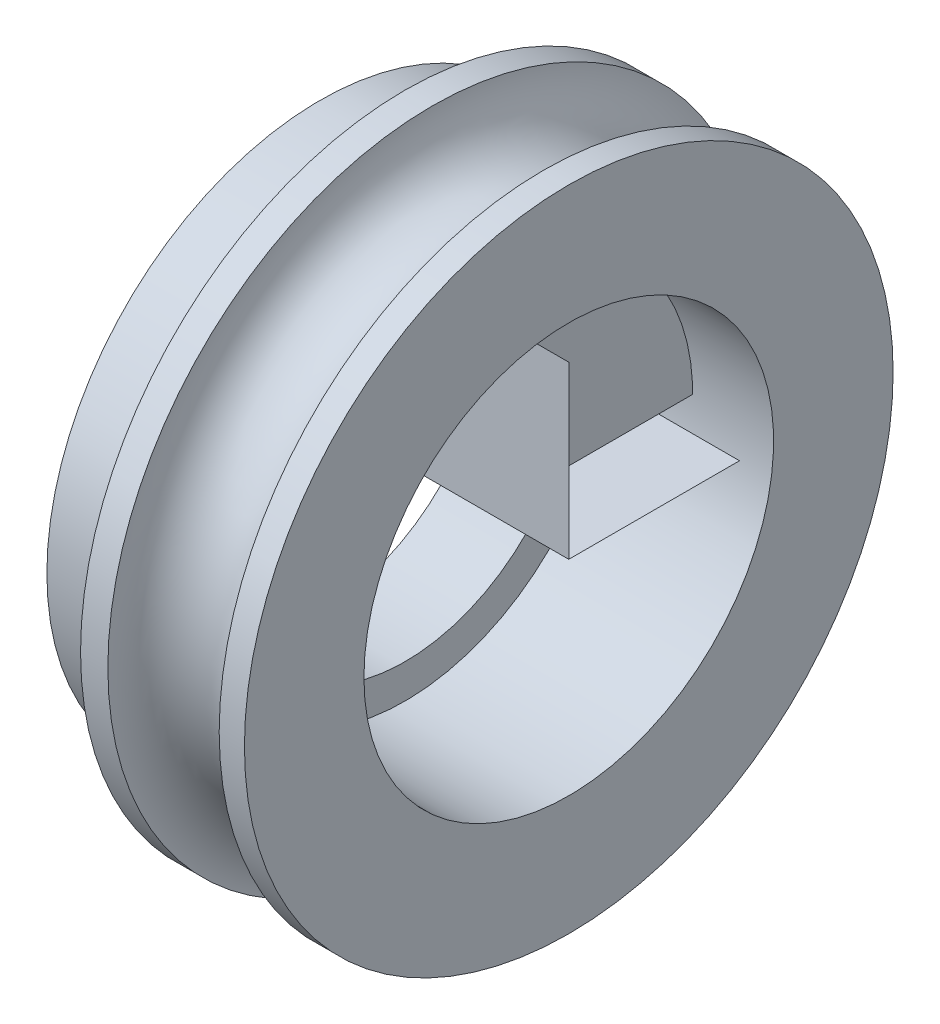
ISO-10303-21;
HEADER;
FILE_DESCRIPTION(('STEP AP214'),'2;1');
FILE_NAME('part.step','',(''),(''),'','','');
FILE_SCHEMA(('AUTOMOTIVE_DESIGN { 1 0 10303 214 1 1 1 1 }'));
ENDSEC;
DATA;
#1=APPLICATION_CONTEXT('core data for automotive mechanical design processes');
#2=APPLICATION_PROTOCOL_DEFINITION('international standard','automotive_design',2000,#1);
#3=PRODUCT_CONTEXT('',#1,'mechanical');
#4=PRODUCT('Part','Part','',(#3));
#5=PRODUCT_RELATED_PRODUCT_CATEGORY('part','',(#4));
#6=PRODUCT_DEFINITION_FORMATION('','',#4);
#7=PRODUCT_DEFINITION_CONTEXT('part definition',#1,'design');
#8=PRODUCT_DEFINITION('design','',#6,#7);
#9=PRODUCT_DEFINITION_SHAPE('','',#8);
#10=(LENGTH_UNIT() NAMED_UNIT(*) SI_UNIT(.MILLI.,.METRE.));
#11=(NAMED_UNIT(*) PLANE_ANGLE_UNIT() SI_UNIT($,.RADIAN.));
#12=(NAMED_UNIT(*) SI_UNIT($,.STERADIAN.) SOLID_ANGLE_UNIT());
#13=UNCERTAINTY_MEASURE_WITH_UNIT(LENGTH_MEASURE(1.E-05),#10,'distance_accuracy_value','');
#14=(GEOMETRIC_REPRESENTATION_CONTEXT(3) GLOBAL_UNCERTAINTY_ASSIGNED_CONTEXT((#13)) GLOBAL_UNIT_ASSIGNED_CONTEXT((#10,
#11,#12)) REPRESENTATION_CONTEXT('',''));
#15=CARTESIAN_POINT('',(0.,0.,0.));
#16=DIRECTION('',(0.,0.,1.));
#17=DIRECTION('',(1.,0.,0.));
#18=AXIS2_PLACEMENT_3D('',#15,#16,#17);
#19=CARTESIAN_POINT('',(2.43012775386618,0.,0.));
#20=DIRECTION('',(1.,0.,0.));
#21=DIRECTION('',(0.,0.,-1.));
#22=AXIS2_PLACEMENT_3D('',#19,#20,#21);
#23=PLANE('',#22);
#24=DIRECTION('',(0.,0.,-1.));
#25=VECTOR('',#24,1.);
#26=CARTESIAN_POINT('',(2.43012775386618,5.,0.));
#27=LINE('',#26,#25);
#28=CARTESIAN_POINT('',(2.43012775386618,5.,0.));
#29=VERTEX_POINT('',#28);
#30=CARTESIAN_POINT('',(2.43012775386618,5.,-6.20938754824373));
#31=VERTEX_POINT('',#30);
#32=EDGE_CURVE('E65',#29,#31,#27,.T.);
#33=ORIENTED_EDGE('',*,*,#32,.F.);
#34=DIRECTION('',(0.,1.,0.));
#35=VECTOR('',#34,1.);
#36=CARTESIAN_POINT('',(2.43012775386618,0.,0.));
#37=LINE('',#36,#35);
#38=CARTESIAN_POINT('',(2.43012775386618,0.,0.));
#39=VERTEX_POINT('',#38);
#40=EDGE_CURVE('E47',#39,#29,#37,.T.);
#41=ORIENTED_EDGE('',*,*,#40,.F.);
#42=DIRECTION('',(0.,0.,-1.));
#43=VECTOR('',#42,1.);
#44=CARTESIAN_POINT('',(2.43012775386618,0.,0.));
#45=LINE('',#44,#43);
#46=CARTESIAN_POINT('',(2.43012775386618,0.,-6.20938754824373));
#47=VERTEX_POINT('',#46);
#48=EDGE_CURVE('E53',#39,#47,#45,.T.);
#49=ORIENTED_EDGE('',*,*,#48,.T.);
#50=DIRECTION('',(0.,1.,0.));
#51=VECTOR('',#50,1.);
#52=CARTESIAN_POINT('',(2.43012775386618,0.,-6.20938754824373));
#53=LINE('',#52,#51);
#54=EDGE_CURVE('E12',#47,#31,#53,.T.);
#55=ORIENTED_EDGE('',*,*,#54,.T.);
#56=EDGE_LOOP('',(#33,#41,#49,#55));
#57=FACE_BOUND('',#56,.T.);
#58=ADVANCED_FACE('F46',(#57),#23,.T.);
#59=OPEN_SHELL('',(#58));
#60=SHELL_BASED_SURFACE_MODEL('B2',(#59));
#61=CARTESIAN_POINT('',(4.79999999999545,0.,0.));
#62=DIRECTION('',(0.,0.,-1.));
#63=DIRECTION('',(-1.,0.,0.));
#64=AXIS2_PLACEMENT_3D('',#61,#62,#63);
#65=PLANE('',#64);
#66=DIRECTION('',(0.,-1.,0.));
#67=VECTOR('',#66,1.);
#68=CARTESIAN_POINT('',(-0.200000000004547,0.,0.));
#69=LINE('',#68,#67);
#70=CARTESIAN_POINT('',(-0.200000000004547,5.,0.));
#71=VERTEX_POINT('',#70);
#72=CARTESIAN_POINT('',(-0.200000000004547,0.,0.));
#73=VERTEX_POINT('',#72);
#74=EDGE_CURVE('E135',#71,#73,#69,.T.);
#75=ORIENTED_EDGE('',*,*,#74,.F.);
#76=DIRECTION('',(-1.,0.,0.));
#77=VECTOR('',#76,1.);
#78=CARTESIAN_POINT('',(4.79999999999545,5.,0.));
#79=LINE('',#78,#77);
#80=CARTESIAN_POINT('',(4.79999999999545,5.,0.));
#81=VERTEX_POINT('',#80);
#82=EDGE_CURVE('E104',#81,#71,#79,.T.);
#83=ORIENTED_EDGE('',*,*,#82,.F.);
#84=DIRECTION('',(0.,-1.,0.));
#85=VECTOR('',#84,1.);
#86=CARTESIAN_POINT('',(4.79999999999545,0.,0.));
#87=LINE('',#86,#85);
#88=CARTESIAN_POINT('',(4.79999999999545,0.,0.));
#89=VERTEX_POINT('',#88);
#90=EDGE_CURVE('E44',#81,#89,#87,.T.);
#91=ORIENTED_EDGE('',*,*,#90,.T.);
#92=DIRECTION('',(-1.,0.,0.));
#93=VECTOR('',#92,1.);
#94=CARTESIAN_POINT('',(4.79999999999545,0.,0.));
#95=LINE('',#94,#93);
#96=EDGE_CURVE('E98',#89,#73,#95,.T.);
#97=ORIENTED_EDGE('',*,*,#96,.T.);
#98=EDGE_LOOP('',(#75,#83,#91,#97));
#99=FACE_BOUND('',#98,.T.);
#100=ADVANCED_FACE('F96',(#99),#65,.T.);
#101=CARTESIAN_POINT('',(4.79999999999545,0.,0.));
#102=DIRECTION('',(0.,1.,0.));
#103=DIRECTION('',(0.,0.,1.));
#104=AXIS2_PLACEMENT_3D('',#101,#102,#103);
#105=PLANE('',#104);
#106=DIRECTION('',(0.,0.,-1.));
#107=VECTOR('',#106,1.);
#108=CARTESIAN_POINT('',(-0.200000000004547,0.,0.));
#109=LINE('',#108,#107);
#110=CARTESIAN_POINT('',(-0.200000000004547,0.,-5.));
#111=VERTEX_POINT('',#110);
#112=EDGE_CURVE('E129',#73,#111,#109,.T.);
#113=ORIENTED_EDGE('',*,*,#112,.F.);
#114=ORIENTED_EDGE('',*,*,#96,.F.);
#115=DIRECTION('',(0.,0.,-1.));
#116=VECTOR('',#115,1.);
#117=CARTESIAN_POINT('',(4.79999999999545,0.,0.));
#118=LINE('',#117,#116);
#119=CARTESIAN_POINT('',(4.79999999999545,0.,-5.));
#120=VERTEX_POINT('',#119);
#121=EDGE_CURVE('E128',#89,#120,#118,.T.);
#122=ORIENTED_EDGE('',*,*,#121,.T.);
#123=DIRECTION('',(-1.,0.,0.));
#124=VECTOR('',#123,1.);
#125=CARTESIAN_POINT('',(4.79999999999545,0.,-5.));
#126=LINE('',#125,#124);
#127=EDGE_CURVE('E110',#120,#111,#126,.T.);
#128=ORIENTED_EDGE('',*,*,#127,.T.);
#129=EDGE_LOOP('',(#113,#114,#122,#128));
#130=FACE_BOUND('',#129,.T.);
#131=ADVANCED_FACE('F127',(#130),#105,.T.);
#132=OPEN_SHELL('',(#100,#131));
#133=SHELL_BASED_SURFACE_MODEL('B6',(#132));
#134=CARTESIAN_POINT('',(-3.18596968241991,0.,0.));
#135=DIRECTION('',(-1.,0.,0.));
#136=DIRECTION('',(0.,0.,1.));
#137=AXIS2_PLACEMENT_3D('',#134,#135,#136);
#138=CYLINDRICAL_SURFACE('',#137,5.);
#139=CARTESIAN_POINT('',(0.,0.,0.));
#140=DIRECTION('',(-1.,0.,0.));
#141=DIRECTION('',(0.,0.,1.));
#142=AXIS2_PLACEMENT_3D('',#139,#140,#141);
#143=CIRCLE('',#142,5.);
#144=CARTESIAN_POINT('',(0.,0.,5.));
#145=VERTEX_POINT('',#144);
#146=EDGE_CURVE('E197',#145,#145,#143,.T.);
#147=ORIENTED_EDGE('',*,*,#146,.F.);
#148=EDGE_LOOP('',(#147));
#149=FACE_BOUND('',#148,.T.);
#150=CARTESIAN_POINT('',(-2.48596968241991,0.,0.));
#151=DIRECTION('',(-1.,0.,0.));
#152=DIRECTION('',(0.,0.,1.));
#153=AXIS2_PLACEMENT_3D('',#150,#151,#152);
#154=CIRCLE('',#153,5.);
#155=CARTESIAN_POINT('',(-2.48596968241991,0.,5.));
#156=VERTEX_POINT('',#155);
#157=EDGE_CURVE('E203',#156,#156,#154,.T.);
#158=ORIENTED_EDGE('',*,*,#157,.T.);
#159=EDGE_LOOP('',(#158));
#160=FACE_BOUND('',#159,.T.);
#161=ADVANCED_FACE('F171',(#149,#160),#138,.F.);
#162=CARTESIAN_POINT('',(-3.18596968241991,0.,0.));
#163=DIRECTION('',(-1.,0.,0.));
#164=DIRECTION('',(0.,0.,1.));
#165=AXIS2_PLACEMENT_3D('',#162,#163,#164);
#166=CYLINDRICAL_SURFACE('',#165,8.);
#167=CARTESIAN_POINT('',(0.,0.,0.));
#168=DIRECTION('',(-1.,0.,0.));
#169=DIRECTION('',(0.,0.,1.));
#170=AXIS2_PLACEMENT_3D('',#167,#168,#169);
#171=CIRCLE('',#170,8.);
#172=CARTESIAN_POINT('',(0.,0.,8.));
#173=VERTEX_POINT('',#172);
#174=EDGE_CURVE('E200',#173,#173,#171,.T.);
#175=ORIENTED_EDGE('',*,*,#174,.T.);
#176=EDGE_LOOP('',(#175));
#177=FACE_BOUND('',#176,.T.);
#178=CARTESIAN_POINT('',(-2.48596968241991,0.,0.));
#179=DIRECTION('',(-1.,0.,0.));
#180=DIRECTION('',(0.,0.,1.));
#181=AXIS2_PLACEMENT_3D('',#178,#179,#180);
#182=CIRCLE('',#181,8.);
#183=CARTESIAN_POINT('',(-2.48596968241991,0.,8.));
#184=VERTEX_POINT('',#183);
#185=EDGE_CURVE('E175',#184,#184,#182,.F.);
#186=ORIENTED_EDGE('',*,*,#185,.T.);
#187=EDGE_LOOP('',(#186));
#188=FACE_BOUND('',#187,.T.);
#189=ADVANCED_FACE('F210',(#177,#188),#166,.T.);
#190=CARTESIAN_POINT('',(0.,-8.,0.));
#191=DIRECTION('',(-1.,0.,0.));
#192=DIRECTION('',(0.,0.,1.));
#193=AXIS2_PLACEMENT_3D('',#190,#191,#192);
#194=PLANE('',#193);
#195=CARTESIAN_POINT('',(0.,0.,0.));
#196=DIRECTION('',(-1.,0.,0.));
#197=DIRECTION('',(0.,0.,1.));
#198=AXIS2_PLACEMENT_3D('',#195,#196,#197);
#199=CIRCLE('',#198,9.5);
#200=CARTESIAN_POINT('',(0.,0.,9.5));
#201=VERTEX_POINT('',#200);
#202=EDGE_CURVE('E95',#201,#201,#199,.T.);
#203=ORIENTED_EDGE('',*,*,#202,.T.);
#204=EDGE_LOOP('',(#203));
#205=FACE_BOUND('',#204,.T.);
#206=ORIENTED_EDGE('',*,*,#174,.F.);
#207=EDGE_LOOP('',(#206));
#208=FACE_BOUND('',#207,.T.);
#209=ADVANCED_FACE('F173',(#205,#208),#194,.T.);
#210=CARTESIAN_POINT('',(-3.18596968241991,0.,0.));
#211=DIRECTION('',(-1.,0.,0.));
#212=DIRECTION('',(0.,0.,1.));
#213=AXIS2_PLACEMENT_3D('',#210,#211,#212);
#214=CYLINDRICAL_SURFACE('',#213,9.5);
#215=CARTESIAN_POINT('',(0.799999999997726,0.,0.));
#216=DIRECTION('',(-1.,0.,0.));
#217=DIRECTION('',(0.,0.,1.));
#218=AXIS2_PLACEMENT_3D('',#215,#216,#217);
#219=CIRCLE('',#218,9.5);
#220=CARTESIAN_POINT('',(0.799999999997726,0.,9.5));
#221=VERTEX_POINT('',#220);
#222=EDGE_CURVE('E179',#221,#221,#219,.T.);
#223=ORIENTED_EDGE('',*,*,#222,.T.);
#224=EDGE_LOOP('',(#223));
#225=FACE_BOUND('',#224,.T.);
#226=ORIENTED_EDGE('',*,*,#202,.F.);
#227=EDGE_LOOP('',(#226));
#228=FACE_BOUND('',#227,.T.);
#229=ADVANCED_FACE('F246',(#225,#228),#214,.T.);
#230=CARTESIAN_POINT('',(2.43012775386618,0.,0.));
#231=DIRECTION('',(-1.,0.,0.));
#232=DIRECTION('',(0.,0.,1.));
#233=AXIS2_PLACEMENT_3D('',#230,#231,#232);
#234=TOROIDAL_SURFACE('',#233,9.5,1.63012775386845);
#235=CARTESIAN_POINT('',(4.06025550773463,0.,0.));
#236=DIRECTION('',(-1.,0.,0.));
#237=DIRECTION('',(0.,0.,1.));
#238=AXIS2_PLACEMENT_3D('',#235,#236,#237);
#239=CIRCLE('',#238,9.5);
#240=CARTESIAN_POINT('',(4.06025550773463,0.,9.5));
#241=VERTEX_POINT('',#240);
#242=EDGE_CURVE('E183',#241,#241,#239,.T.);
#243=ORIENTED_EDGE('',*,*,#242,.T.);
#244=EDGE_LOOP('',(#243));
#245=FACE_BOUND('',#244,.T.);
#246=ORIENTED_EDGE('',*,*,#222,.F.);
#247=EDGE_LOOP('',(#246));
#248=FACE_BOUND('',#247,.T.);
#249=ADVANCED_FACE('F243',(#245,#248),#234,.F.);
#250=CARTESIAN_POINT('',(-3.18596968241991,0.,0.));
#251=DIRECTION('',(-1.,0.,0.));
#252=DIRECTION('',(0.,0.,1.));
#253=AXIS2_PLACEMENT_3D('',#250,#251,#252);
#254=CYLINDRICAL_SURFACE('',#253,9.5);
#255=CARTESIAN_POINT('',(4.79999999999545,0.,0.));
#256=DIRECTION('',(-1.,0.,0.));
#257=DIRECTION('',(0.,0.,1.));
#258=AXIS2_PLACEMENT_3D('',#255,#256,#257);
#259=CIRCLE('',#258,9.5);
#260=CARTESIAN_POINT('',(4.79999999999545,0.,9.5));
#261=VERTEX_POINT('',#260);
#262=EDGE_CURVE('E188',#261,#261,#259,.T.);
#263=ORIENTED_EDGE('',*,*,#262,.T.);
#264=EDGE_LOOP('',(#263));
#265=FACE_BOUND('',#264,.T.);
#266=ORIENTED_EDGE('',*,*,#242,.F.);
#267=EDGE_LOOP('',(#266));
#268=FACE_BOUND('',#267,.T.);
#269=ADVANCED_FACE('F239',(#265,#268),#254,.T.);
#270=CARTESIAN_POINT('',(4.79999999999545,-9.5,0.));
#271=DIRECTION('',(1.,0.,0.));
#272=DIRECTION('',(0.,0.,-1.));
#273=AXIS2_PLACEMENT_3D('',#270,#271,#272);
#274=PLANE('',#273);
#275=CARTESIAN_POINT('',(4.79999999999545,0.,0.));
#276=DIRECTION('',(-1.,0.,0.));
#277=DIRECTION('',(0.,0.,1.));
#278=AXIS2_PLACEMENT_3D('',#275,#276,#277);
#279=CIRCLE('',#278,6.);
#280=CARTESIAN_POINT('',(4.79999999999545,0.,6.));
#281=VERTEX_POINT('',#280);
#282=EDGE_CURVE('E191',#281,#281,#279,.T.);
#283=ORIENTED_EDGE('',*,*,#282,.T.);
#284=EDGE_LOOP('',(#283));
#285=FACE_BOUND('',#284,.T.);
#286=ORIENTED_EDGE('',*,*,#262,.F.);
#287=EDGE_LOOP('',(#286));
#288=FACE_BOUND('',#287,.T.);
#289=ADVANCED_FACE('F235',(#285,#288),#274,.T.);
#290=CARTESIAN_POINT('',(-3.18596968241991,0.,0.));
#291=DIRECTION('',(-1.,0.,0.));
#292=DIRECTION('',(0.,0.,1.));
#293=AXIS2_PLACEMENT_3D('',#290,#291,#292);
#294=CYLINDRICAL_SURFACE('',#293,6.);
#295=CARTESIAN_POINT('',(0.,0.,0.));
#296=DIRECTION('',(-1.,0.,0.));
#297=DIRECTION('',(0.,0.,1.));
#298=AXIS2_PLACEMENT_3D('',#295,#296,#297);
#299=CIRCLE('',#298,6.);
#300=CARTESIAN_POINT('',(0.,0.,6.));
#301=VERTEX_POINT('',#300);
#302=EDGE_CURVE('E194',#301,#301,#299,.T.);
#303=ORIENTED_EDGE('',*,*,#302,.T.);
#304=EDGE_LOOP('',(#303));
#305=FACE_BOUND('',#304,.T.);
#306=ORIENTED_EDGE('',*,*,#282,.F.);
#307=EDGE_LOOP('',(#306));
#308=FACE_BOUND('',#307,.T.);
#309=ADVANCED_FACE('F220',(#305,#308),#294,.F.);
#310=CARTESIAN_POINT('',(0.,-5.,0.));
#311=DIRECTION('',(1.,0.,0.));
#312=DIRECTION('',(0.,0.,-1.));
#313=AXIS2_PLACEMENT_3D('',#310,#311,#312);
#314=PLANE('',#313);
#315=ORIENTED_EDGE('',*,*,#146,.T.);
#316=EDGE_LOOP('',(#315));
#317=FACE_BOUND('',#316,.T.);
#318=ORIENTED_EDGE('',*,*,#302,.F.);
#319=EDGE_LOOP('',(#318));
#320=FACE_BOUND('',#319,.T.);
#321=ADVANCED_FACE('F214',(#317,#320),#314,.T.);
#322=CARTESIAN_POINT('',(-2.48596968241991,0.,0.));
#323=DIRECTION('',(-1.,0.,0.));
#324=DIRECTION('',(0.,0.,1.));
#325=AXIS2_PLACEMENT_3D('',#322,#323,#324);
#326=PLANE('',#325);
#327=ORIENTED_EDGE('',*,*,#157,.F.);
#328=EDGE_LOOP('',(#327));
#329=FACE_BOUND('',#328,.T.);
#330=ORIENTED_EDGE('',*,*,#185,.F.);
#331=EDGE_LOOP('',(#330));
#332=FACE_BOUND('',#331,.T.);
#333=ADVANCED_FACE('F212',(#329,#332),#326,.T.);
#334=CLOSED_SHELL('',(#161,#189,#209,#229,#249,#269,#289,#309,#321,#333));
#335=MANIFOLD_SOLID_BREP('B38',#334);
#336=ADVANCED_BREP_SHAPE_REPRESENTATION('',(#18,#335),#14);
#337=MANIFOLD_SURFACE_SHAPE_REPRESENTATION('',(#18,#60,#133),#14);
#338=SHAPE_REPRESENTATION('',(#18),#14);
#339=SHAPE_DEFINITION_REPRESENTATION(#9,#338);
#340=SHAPE_REPRESENTATION_RELATIONSHIP('','',#338,#336);
#341=SHAPE_REPRESENTATION_RELATIONSHIP('','',#338,#337);
ENDSEC;
END-ISO-10303-21;
